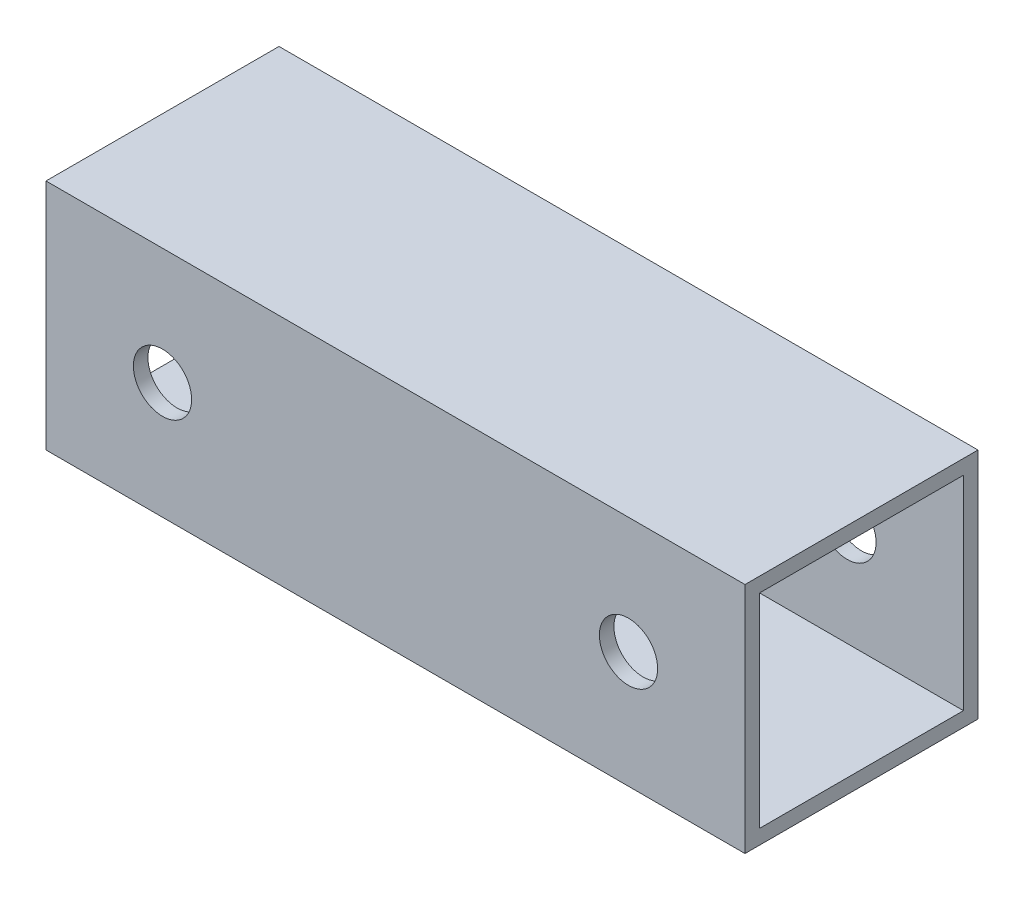
ISO-10303-21;
HEADER;
FILE_DESCRIPTION(('STEP AP214'),'2;1');
FILE_NAME('part.step','',(''),(''),'','','');
FILE_SCHEMA(('AUTOMOTIVE_DESIGN { 1 0 10303 214 1 1 1 1 }'));
ENDSEC;
DATA;
#1=APPLICATION_CONTEXT('core data for automotive mechanical design processes');
#2=APPLICATION_PROTOCOL_DEFINITION('international standard','automotive_design',2000,#1);
#3=PRODUCT_CONTEXT('',#1,'mechanical');
#4=PRODUCT('Part','Part','',(#3));
#5=PRODUCT_RELATED_PRODUCT_CATEGORY('part','',(#4));
#6=PRODUCT_DEFINITION_FORMATION('','',#4);
#7=PRODUCT_DEFINITION_CONTEXT('part definition',#1,'design');
#8=PRODUCT_DEFINITION('design','',#6,#7);
#9=PRODUCT_DEFINITION_SHAPE('','',#8);
#10=(LENGTH_UNIT() NAMED_UNIT(*) SI_UNIT(.MILLI.,.METRE.));
#11=(NAMED_UNIT(*) PLANE_ANGLE_UNIT() SI_UNIT($,.RADIAN.));
#12=(NAMED_UNIT(*) SI_UNIT($,.STERADIAN.) SOLID_ANGLE_UNIT());
#13=UNCERTAINTY_MEASURE_WITH_UNIT(LENGTH_MEASURE(1.E-05),#10,'distance_accuracy_value','');
#14=(GEOMETRIC_REPRESENTATION_CONTEXT(3) GLOBAL_UNCERTAINTY_ASSIGNED_CONTEXT((#13)) GLOBAL_UNIT_ASSIGNED_CONTEXT((#10,
#11,#12)) REPRESENTATION_CONTEXT('',''));
#15=CARTESIAN_POINT('',(0.,0.,0.));
#16=DIRECTION('',(0.,0.,1.));
#17=DIRECTION('',(1.,0.,0.));
#18=AXIS2_PLACEMENT_3D('',#15,#16,#17);
#19=CARTESIAN_POINT('',(76.2,0.,0.));
#20=DIRECTION('',(1.,0.,0.));
#21=DIRECTION('',(0.,0.,-1.));
#22=AXIS2_PLACEMENT_3D('',#19,#20,#21);
#23=PLANE('',#22);
#24=DIRECTION('',(0.,1.,0.));
#25=VECTOR('',#24,1.);
#26=CARTESIAN_POINT('',(76.2,12.7,-12.7));
#27=LINE('',#26,#25);
#28=CARTESIAN_POINT('',(76.2,-12.7,-12.7));
#29=VERTEX_POINT('',#28);
#30=CARTESIAN_POINT('',(76.2,12.7,-12.7));
#31=VERTEX_POINT('',#30);
#32=EDGE_CURVE('E139',#29,#31,#27,.T.);
#33=ORIENTED_EDGE('',*,*,#32,.T.);
#34=DIRECTION('',(0.,0.,1.));
#35=VECTOR('',#34,1.);
#36=CARTESIAN_POINT('',(76.2,12.7,12.7));
#37=LINE('',#36,#35);
#38=CARTESIAN_POINT('',(76.2,12.7,12.7));
#39=VERTEX_POINT('',#38);
#40=EDGE_CURVE('E142',#31,#39,#37,.T.);
#41=ORIENTED_EDGE('',*,*,#40,.T.);
#42=DIRECTION('',(0.,-1.,0.));
#43=VECTOR('',#42,1.);
#44=CARTESIAN_POINT('',(76.2,12.7,12.7));
#45=LINE('',#44,#43);
#46=CARTESIAN_POINT('',(76.2,-12.7,12.7));
#47=VERTEX_POINT('',#46);
#48=EDGE_CURVE('E145',#39,#47,#45,.T.);
#49=ORIENTED_EDGE('',*,*,#48,.T.);
#50=DIRECTION('',(0.,0.,-1.));
#51=VECTOR('',#50,1.);
#52=CARTESIAN_POINT('',(76.2,-12.7,12.7));
#53=LINE('',#52,#51);
#54=EDGE_CURVE('E147',#47,#29,#53,.T.);
#55=ORIENTED_EDGE('',*,*,#54,.T.);
#56=EDGE_LOOP('',(#33,#41,#49,#55));
#57=FACE_BOUND('',#56,.T.);
#58=DIRECTION('',(0.,0.,-1.));
#59=VECTOR('',#58,1.);
#60=CARTESIAN_POINT('',(76.2,-11.1125,-11.1125));
#61=LINE('',#60,#59);
#62=CARTESIAN_POINT('',(76.2,-11.1125,11.1125));
#63=VERTEX_POINT('',#62);
#64=CARTESIAN_POINT('',(76.2,-11.1125,-11.1125));
#65=VERTEX_POINT('',#64);
#66=EDGE_CURVE('E109',#63,#65,#61,.T.);
#67=ORIENTED_EDGE('',*,*,#66,.F.);
#68=DIRECTION('',(0.,-1.,0.));
#69=VECTOR('',#68,1.);
#70=CARTESIAN_POINT('',(76.2,-11.1125,11.1125));
#71=LINE('',#70,#69);
#72=CARTESIAN_POINT('',(76.2,11.1125,11.1125));
#73=VERTEX_POINT('',#72);
#74=EDGE_CURVE('E101',#73,#63,#71,.T.);
#75=ORIENTED_EDGE('',*,*,#74,.F.);
#76=DIRECTION('',(0.,0.,1.));
#77=VECTOR('',#76,1.);
#78=CARTESIAN_POINT('',(76.2,11.1125,-11.1125));
#79=LINE('',#78,#77);
#80=CARTESIAN_POINT('',(76.2,11.1125,-11.1125));
#81=VERTEX_POINT('',#80);
#82=EDGE_CURVE('E123',#81,#73,#79,.T.);
#83=ORIENTED_EDGE('',*,*,#82,.F.);
#84=DIRECTION('',(0.,1.,0.));
#85=VECTOR('',#84,1.);
#86=CARTESIAN_POINT('',(76.2,-11.1125,-11.1125));
#87=LINE('',#86,#85);
#88=EDGE_CURVE('E121',#65,#81,#87,.T.);
#89=ORIENTED_EDGE('',*,*,#88,.F.);
#90=EDGE_LOOP('',(#67,#75,#83,#89));
#91=FACE_BOUND('',#90,.T.);
#92=ADVANCED_FACE('F34',(#57,#91),#23,.T.);
#93=CARTESIAN_POINT('',(0.,0.,0.));
#94=DIRECTION('',(1.,0.,0.));
#95=DIRECTION('',(0.,0.,-1.));
#96=AXIS2_PLACEMENT_3D('',#93,#94,#95);
#97=PLANE('',#96);
#98=DIRECTION('',(0.,1.,0.));
#99=VECTOR('',#98,1.);
#100=CARTESIAN_POINT('',(0.,12.7,-12.7));
#101=LINE('',#100,#99);
#102=CARTESIAN_POINT('',(0.,-12.7,-12.7));
#103=VERTEX_POINT('',#102);
#104=CARTESIAN_POINT('',(0.,12.7,-12.7));
#105=VERTEX_POINT('',#104);
#106=EDGE_CURVE('E117',#103,#105,#101,.T.);
#107=ORIENTED_EDGE('',*,*,#106,.F.);
#108=DIRECTION('',(0.,0.,-1.));
#109=VECTOR('',#108,1.);
#110=CARTESIAN_POINT('',(0.,-12.7,12.7));
#111=LINE('',#110,#109);
#112=CARTESIAN_POINT('',(0.,-12.7,12.7));
#113=VERTEX_POINT('',#112);
#114=EDGE_CURVE('E143',#113,#103,#111,.T.);
#115=ORIENTED_EDGE('',*,*,#114,.F.);
#116=DIRECTION('',(0.,-1.,0.));
#117=VECTOR('',#116,1.);
#118=CARTESIAN_POINT('',(0.,12.7,12.7));
#119=LINE('',#118,#117);
#120=CARTESIAN_POINT('',(0.,12.7,12.7));
#121=VERTEX_POINT('',#120);
#122=EDGE_CURVE('E154',#121,#113,#119,.T.);
#123=ORIENTED_EDGE('',*,*,#122,.F.);
#124=DIRECTION('',(0.,0.,1.));
#125=VECTOR('',#124,1.);
#126=CARTESIAN_POINT('',(0.,12.7,12.7));
#127=LINE('',#126,#125);
#128=EDGE_CURVE('E152',#105,#121,#127,.T.);
#129=ORIENTED_EDGE('',*,*,#128,.F.);
#130=EDGE_LOOP('',(#107,#115,#123,#129));
#131=FACE_BOUND('',#130,.T.);
#132=DIRECTION('',(0.,-1.,0.));
#133=VECTOR('',#132,1.);
#134=CARTESIAN_POINT('',(0.,-11.1125,11.1125));
#135=LINE('',#134,#133);
#136=CARTESIAN_POINT('',(0.,11.1125,11.1125));
#137=VERTEX_POINT('',#136);
#138=CARTESIAN_POINT('',(0.,-11.1125,11.1125));
#139=VERTEX_POINT('',#138);
#140=EDGE_CURVE('E59',#137,#139,#135,.T.);
#141=ORIENTED_EDGE('',*,*,#140,.T.);
#142=DIRECTION('',(0.,0.,-1.));
#143=VECTOR('',#142,1.);
#144=CARTESIAN_POINT('',(0.,-11.1125,-11.1125));
#145=LINE('',#144,#143);
#146=CARTESIAN_POINT('',(0.,-11.1125,-11.1125));
#147=VERTEX_POINT('',#146);
#148=EDGE_CURVE('E116',#139,#147,#145,.T.);
#149=ORIENTED_EDGE('',*,*,#148,.T.);
#150=DIRECTION('',(0.,1.,0.));
#151=VECTOR('',#150,1.);
#152=CARTESIAN_POINT('',(0.,-11.1125,-11.1125));
#153=LINE('',#152,#151);
#154=CARTESIAN_POINT('',(0.,11.1125,-11.1125));
#155=VERTEX_POINT('',#154);
#156=EDGE_CURVE('E131',#147,#155,#153,.T.);
#157=ORIENTED_EDGE('',*,*,#156,.T.);
#158=DIRECTION('',(0.,0.,1.));
#159=VECTOR('',#158,1.);
#160=CARTESIAN_POINT('',(0.,11.1125,-11.1125));
#161=LINE('',#160,#159);
#162=EDGE_CURVE('E110',#155,#137,#161,.T.);
#163=ORIENTED_EDGE('',*,*,#162,.T.);
#164=EDGE_LOOP('',(#141,#149,#157,#163));
#165=FACE_BOUND('',#164,.T.);
#166=ADVANCED_FACE('F201',(#131,#165),#97,.F.);
#167=CARTESIAN_POINT('',(76.2,12.7,-12.7));
#168=DIRECTION('',(0.,0.,1.));
#169=DIRECTION('',(1.,0.,0.));
#170=AXIS2_PLACEMENT_3D('',#167,#168,#169);
#171=PLANE('',#170);
#172=CARTESIAN_POINT('',(63.5,0.,-12.7));
#173=DIRECTION('',(0.,0.,1.));
#174=DIRECTION('',(1.,0.,0.));
#175=AXIS2_PLACEMENT_3D('',#172,#173,#174);
#176=CIRCLE('',#175,3.175);
#177=CARTESIAN_POINT('',(66.675,0.,-12.7));
#178=VERTEX_POINT('',#177);
#179=EDGE_CURVE('E183',#178,#178,#176,.T.);
#180=ORIENTED_EDGE('',*,*,#179,.T.);
#181=EDGE_LOOP('',(#180));
#182=FACE_BOUND('',#181,.T.);
#183=CARTESIAN_POINT('',(12.7,0.,-12.7));
#184=DIRECTION('',(0.,0.,1.));
#185=DIRECTION('',(1.,0.,0.));
#186=AXIS2_PLACEMENT_3D('',#183,#184,#185);
#187=CIRCLE('',#186,3.175);
#188=CARTESIAN_POINT('',(15.875,0.,-12.7));
#189=VERTEX_POINT('',#188);
#190=EDGE_CURVE('E165',#189,#189,#187,.T.);
#191=ORIENTED_EDGE('',*,*,#190,.T.);
#192=EDGE_LOOP('',(#191));
#193=FACE_BOUND('',#192,.T.);
#194=ORIENTED_EDGE('',*,*,#106,.T.);
#195=DIRECTION('',(-1.,0.,0.));
#196=VECTOR('',#195,1.);
#197=CARTESIAN_POINT('',(76.2,12.7,-12.7));
#198=LINE('',#197,#196);
#199=EDGE_CURVE('E11',#31,#105,#198,.T.);
#200=ORIENTED_EDGE('',*,*,#199,.F.);
#201=ORIENTED_EDGE('',*,*,#32,.F.);
#202=DIRECTION('',(-1.,0.,0.));
#203=VECTOR('',#202,1.);
#204=CARTESIAN_POINT('',(76.2,-12.7,-12.7));
#205=LINE('',#204,#203);
#206=EDGE_CURVE('E149',#29,#103,#205,.T.);
#207=ORIENTED_EDGE('',*,*,#206,.T.);
#208=EDGE_LOOP('',(#194,#200,#201,#207));
#209=FACE_BOUND('',#208,.T.);
#210=ADVANCED_FACE('F36',(#182,#193,#209),#171,.F.);
#211=CARTESIAN_POINT('',(76.2,12.7,12.7));
#212=DIRECTION('',(0.,-1.,0.));
#213=DIRECTION('',(0.,0.,-1.));
#214=AXIS2_PLACEMENT_3D('',#211,#212,#213);
#215=PLANE('',#214);
#216=ORIENTED_EDGE('',*,*,#128,.T.);
#217=DIRECTION('',(-1.,0.,0.));
#218=VECTOR('',#217,1.);
#219=CARTESIAN_POINT('',(76.2,12.7,12.7));
#220=LINE('',#219,#218);
#221=EDGE_CURVE('E43',#39,#121,#220,.T.);
#222=ORIENTED_EDGE('',*,*,#221,.F.);
#223=ORIENTED_EDGE('',*,*,#40,.F.);
#224=ORIENTED_EDGE('',*,*,#199,.T.);
#225=EDGE_LOOP('',(#216,#222,#223,#224));
#226=FACE_BOUND('',#225,.T.);
#227=ADVANCED_FACE('F227',(#226),#215,.F.);
#228=CARTESIAN_POINT('',(76.2,12.7,12.7));
#229=DIRECTION('',(0.,0.,-1.));
#230=DIRECTION('',(0.,1.,0.));
#231=AXIS2_PLACEMENT_3D('',#228,#229,#230);
#232=PLANE('',#231);
#233=CARTESIAN_POINT('',(63.5,0.,12.7));
#234=DIRECTION('',(0.,0.,1.));
#235=DIRECTION('',(1.,0.,0.));
#236=AXIS2_PLACEMENT_3D('',#233,#234,#235);
#237=CIRCLE('',#236,3.175);
#238=CARTESIAN_POINT('',(66.675,0.,12.7));
#239=VERTEX_POINT('',#238);
#240=EDGE_CURVE('E180',#239,#239,#237,.T.);
#241=ORIENTED_EDGE('',*,*,#240,.F.);
#242=EDGE_LOOP('',(#241));
#243=FACE_BOUND('',#242,.T.);
#244=CARTESIAN_POINT('',(12.7,0.,12.7));
#245=DIRECTION('',(0.,0.,1.));
#246=DIRECTION('',(1.,0.,0.));
#247=AXIS2_PLACEMENT_3D('',#244,#245,#246);
#248=CIRCLE('',#247,3.175);
#249=CARTESIAN_POINT('',(15.875,0.,12.7));
#250=VERTEX_POINT('',#249);
#251=EDGE_CURVE('E170',#250,#250,#248,.T.);
#252=ORIENTED_EDGE('',*,*,#251,.F.);
#253=EDGE_LOOP('',(#252));
#254=FACE_BOUND('',#253,.T.);
#255=ORIENTED_EDGE('',*,*,#122,.T.);
#256=DIRECTION('',(-1.,0.,0.));
#257=VECTOR('',#256,1.);
#258=CARTESIAN_POINT('',(76.2,-12.7,12.7));
#259=LINE('',#258,#257);
#260=EDGE_CURVE('E159',#47,#113,#259,.T.);
#261=ORIENTED_EDGE('',*,*,#260,.F.);
#262=ORIENTED_EDGE('',*,*,#48,.F.);
#263=ORIENTED_EDGE('',*,*,#221,.T.);
#264=EDGE_LOOP('',(#255,#261,#262,#263));
#265=FACE_BOUND('',#264,.T.);
#266=ADVANCED_FACE('F224',(#243,#254,#265),#232,.F.);
#267=CARTESIAN_POINT('',(76.2,-12.7,12.7));
#268=DIRECTION('',(0.,1.,0.));
#269=DIRECTION('',(0.,0.,1.));
#270=AXIS2_PLACEMENT_3D('',#267,#268,#269);
#271=PLANE('',#270);
#272=ORIENTED_EDGE('',*,*,#114,.T.);
#273=ORIENTED_EDGE('',*,*,#206,.F.);
#274=ORIENTED_EDGE('',*,*,#54,.F.);
#275=ORIENTED_EDGE('',*,*,#260,.T.);
#276=EDGE_LOOP('',(#272,#273,#274,#275));
#277=FACE_BOUND('',#276,.T.);
#278=ADVANCED_FACE('F221',(#277),#271,.F.);
#279=CARTESIAN_POINT('',(76.2,-11.1125,11.1125));
#280=DIRECTION('',(0.,0.,-1.));
#281=DIRECTION('',(-1.,0.,0.));
#282=AXIS2_PLACEMENT_3D('',#279,#280,#281);
#283=PLANE('',#282);
#284=CARTESIAN_POINT('',(63.5,0.,11.1125));
#285=DIRECTION('',(0.,0.,-1.));
#286=DIRECTION('',(-1.,0.,0.));
#287=AXIS2_PLACEMENT_3D('',#284,#285,#286);
#288=CIRCLE('',#287,3.175);
#289=CARTESIAN_POINT('',(60.325,0.,11.1125));
#290=VERTEX_POINT('',#289);
#291=EDGE_CURVE('E175',#290,#290,#288,.T.);
#292=ORIENTED_EDGE('',*,*,#291,.F.);
#293=EDGE_LOOP('',(#292));
#294=FACE_BOUND('',#293,.T.);
#295=CARTESIAN_POINT('',(12.7,0.,11.1125));
#296=DIRECTION('',(0.,0.,-1.));
#297=DIRECTION('',(-1.,0.,0.));
#298=AXIS2_PLACEMENT_3D('',#295,#296,#297);
#299=CIRCLE('',#298,3.175);
#300=CARTESIAN_POINT('',(9.525,0.,11.1125));
#301=VERTEX_POINT('',#300);
#302=EDGE_CURVE('E129',#301,#301,#299,.T.);
#303=ORIENTED_EDGE('',*,*,#302,.F.);
#304=EDGE_LOOP('',(#303));
#305=FACE_BOUND('',#304,.T.);
#306=ORIENTED_EDGE('',*,*,#140,.F.);
#307=DIRECTION('',(-1.,0.,0.));
#308=VECTOR('',#307,1.);
#309=CARTESIAN_POINT('',(76.2,11.1125,11.1125));
#310=LINE('',#309,#308);
#311=EDGE_CURVE('E105',#73,#137,#310,.T.);
#312=ORIENTED_EDGE('',*,*,#311,.F.);
#313=ORIENTED_EDGE('',*,*,#74,.T.);
#314=DIRECTION('',(-1.,0.,0.));
#315=VECTOR('',#314,1.);
#316=CARTESIAN_POINT('',(76.2,-11.1125,11.1125));
#317=LINE('',#316,#315);
#318=EDGE_CURVE('E104',#63,#139,#317,.T.);
#319=ORIENTED_EDGE('',*,*,#318,.T.);
#320=EDGE_LOOP('',(#306,#312,#313,#319));
#321=FACE_BOUND('',#320,.T.);
#322=ADVANCED_FACE('F103',(#294,#305,#321),#283,.T.);
#323=CARTESIAN_POINT('',(76.2,-11.1125,-11.1125));
#324=DIRECTION('',(0.,1.,0.));
#325=DIRECTION('',(0.,0.,1.));
#326=AXIS2_PLACEMENT_3D('',#323,#324,#325);
#327=PLANE('',#326);
#328=ORIENTED_EDGE('',*,*,#148,.F.);
#329=ORIENTED_EDGE('',*,*,#318,.F.);
#330=ORIENTED_EDGE('',*,*,#66,.T.);
#331=DIRECTION('',(-1.,0.,0.));
#332=VECTOR('',#331,1.);
#333=CARTESIAN_POINT('',(76.2,-11.1125,-11.1125));
#334=LINE('',#333,#332);
#335=EDGE_CURVE('E118',#65,#147,#334,.T.);
#336=ORIENTED_EDGE('',*,*,#335,.T.);
#337=EDGE_LOOP('',(#328,#329,#330,#336));
#338=FACE_BOUND('',#337,.T.);
#339=ADVANCED_FACE('F113',(#338),#327,.T.);
#340=CARTESIAN_POINT('',(76.2,-11.1125,-11.1125));
#341=DIRECTION('',(0.,0.,1.));
#342=DIRECTION('',(1.,0.,0.));
#343=AXIS2_PLACEMENT_3D('',#340,#341,#342);
#344=PLANE('',#343);
#345=CARTESIAN_POINT('',(63.5,0.,-11.1125));
#346=DIRECTION('',(0.,0.,1.));
#347=DIRECTION('',(1.,0.,0.));
#348=AXIS2_PLACEMENT_3D('',#345,#346,#347);
#349=CIRCLE('',#348,3.175);
#350=CARTESIAN_POINT('',(66.675,0.,-11.1125));
#351=VERTEX_POINT('',#350);
#352=EDGE_CURVE('E38',#351,#351,#349,.T.);
#353=ORIENTED_EDGE('',*,*,#352,.F.);
#354=EDGE_LOOP('',(#353));
#355=FACE_BOUND('',#354,.T.);
#356=CARTESIAN_POINT('',(12.7,0.,-11.1125));
#357=DIRECTION('',(0.,0.,1.));
#358=DIRECTION('',(1.,0.,0.));
#359=AXIS2_PLACEMENT_3D('',#356,#357,#358);
#360=CIRCLE('',#359,3.175);
#361=CARTESIAN_POINT('',(15.875,0.,-11.1125));
#362=VERTEX_POINT('',#361);
#363=EDGE_CURVE('E163',#362,#362,#360,.T.);
#364=ORIENTED_EDGE('',*,*,#363,.F.);
#365=EDGE_LOOP('',(#364));
#366=FACE_BOUND('',#365,.T.);
#367=ORIENTED_EDGE('',*,*,#156,.F.);
#368=ORIENTED_EDGE('',*,*,#335,.F.);
#369=ORIENTED_EDGE('',*,*,#88,.T.);
#370=DIRECTION('',(-1.,0.,0.));
#371=VECTOR('',#370,1.);
#372=CARTESIAN_POINT('',(76.2,11.1125,-11.1125));
#373=LINE('',#372,#371);
#374=EDGE_CURVE('E51',#81,#155,#373,.T.);
#375=ORIENTED_EDGE('',*,*,#374,.T.);
#376=EDGE_LOOP('',(#367,#368,#369,#375));
#377=FACE_BOUND('',#376,.T.);
#378=ADVANCED_FACE('F193',(#355,#366,#377),#344,.T.);
#379=CARTESIAN_POINT('',(76.2,11.1125,-11.1125));
#380=DIRECTION('',(0.,-1.,0.));
#381=DIRECTION('',(0.,0.,-1.));
#382=AXIS2_PLACEMENT_3D('',#379,#380,#381);
#383=PLANE('',#382);
#384=ORIENTED_EDGE('',*,*,#162,.F.);
#385=ORIENTED_EDGE('',*,*,#374,.F.);
#386=ORIENTED_EDGE('',*,*,#82,.T.);
#387=ORIENTED_EDGE('',*,*,#311,.T.);
#388=EDGE_LOOP('',(#384,#385,#386,#387));
#389=FACE_BOUND('',#388,.T.);
#390=ADVANCED_FACE('F196',(#389),#383,.T.);
#391=CARTESIAN_POINT('',(12.7,0.,-12.7));
#392=DIRECTION('',(0.,0.,1.));
#393=DIRECTION('',(1.,0.,0.));
#394=AXIS2_PLACEMENT_3D('',#391,#392,#393);
#395=CYLINDRICAL_SURFACE('',#394,3.175);
#396=ORIENTED_EDGE('',*,*,#363,.T.);
#397=EDGE_LOOP('',(#396));
#398=FACE_BOUND('',#397,.T.);
#399=ORIENTED_EDGE('',*,*,#190,.F.);
#400=EDGE_LOOP('',(#399));
#401=FACE_BOUND('',#400,.T.);
#402=ADVANCED_FACE('F203',(#398,#401),#395,.F.);
#403=ORIENTED_EDGE('',*,*,#302,.T.);
#404=EDGE_LOOP('',(#403));
#405=FACE_BOUND('',#404,.T.);
#406=ORIENTED_EDGE('',*,*,#251,.T.);
#407=EDGE_LOOP('',(#406));
#408=FACE_BOUND('',#407,.T.);
#409=ADVANCED_FACE('F208',(#405,#408),#395,.F.);
#410=CARTESIAN_POINT('',(63.5,0.,-12.7));
#411=DIRECTION('',(0.,0.,1.));
#412=DIRECTION('',(1.,0.,0.));
#413=AXIS2_PLACEMENT_3D('',#410,#411,#412);
#414=CYLINDRICAL_SURFACE('',#413,3.175);
#415=ORIENTED_EDGE('',*,*,#352,.T.);
#416=EDGE_LOOP('',(#415));
#417=FACE_BOUND('',#416,.T.);
#418=ORIENTED_EDGE('',*,*,#179,.F.);
#419=EDGE_LOOP('',(#418));
#420=FACE_BOUND('',#419,.T.);
#421=ADVANCED_FACE('F190',(#417,#420),#414,.F.);
#422=ORIENTED_EDGE('',*,*,#291,.T.);
#423=EDGE_LOOP('',(#422));
#424=FACE_BOUND('',#423,.T.);
#425=ORIENTED_EDGE('',*,*,#240,.T.);
#426=EDGE_LOOP('',(#425));
#427=FACE_BOUND('',#426,.T.);
#428=ADVANCED_FACE('F324',(#424,#427),#414,.F.);
#429=CLOSED_SHELL('',(#92,#166,#210,#227,#266,#278,#322,#339,#378,#390,#402,#409,#421,#428));
#430=MANIFOLD_SOLID_BREP('B2',#429);
#431=ADVANCED_BREP_SHAPE_REPRESENTATION('',(#18,#430),#14);
#432=SHAPE_DEFINITION_REPRESENTATION(#9,#431);
ENDSEC;
END-ISO-10303-21;
